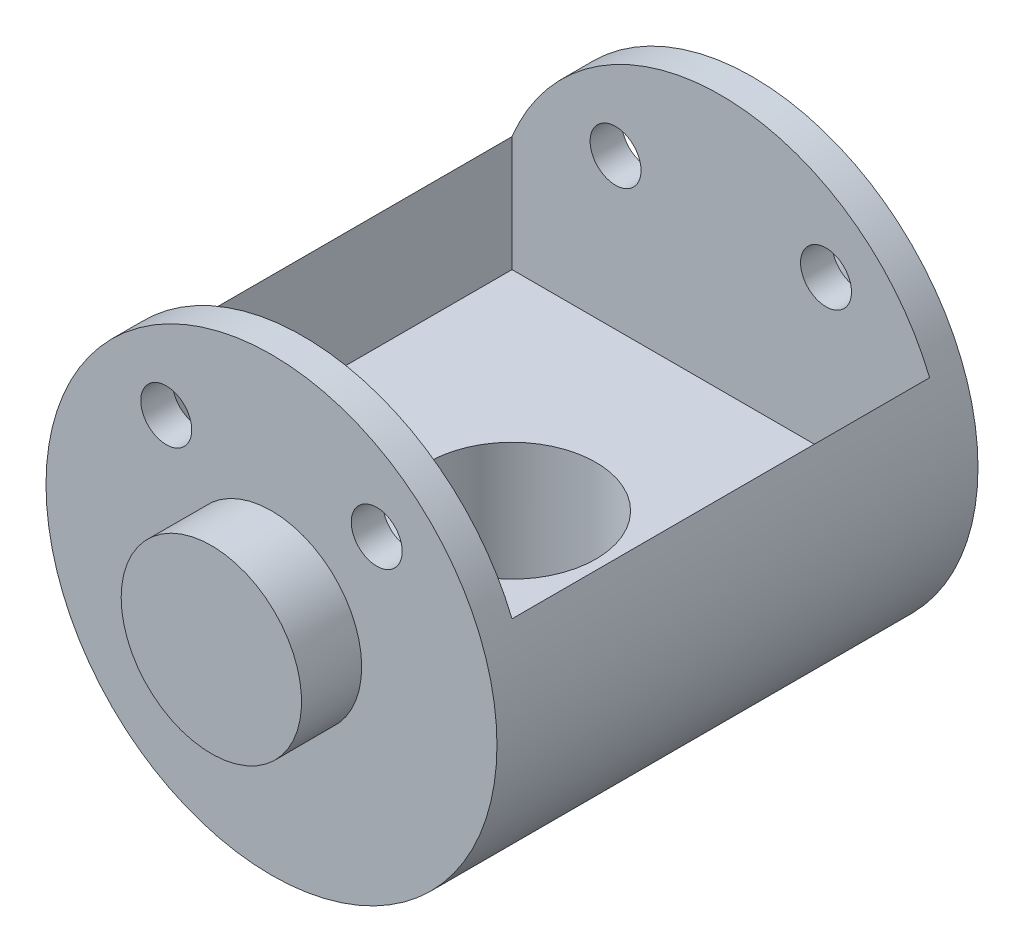
ISO-10303-21;
HEADER;
FILE_DESCRIPTION(('STEP AP214'),'2;1');
FILE_NAME('part.step','',(''),(''),'','','');
FILE_SCHEMA(('AUTOMOTIVE_DESIGN { 1 0 10303 214 1 1 1 1 }'));
ENDSEC;
DATA;
#1=APPLICATION_CONTEXT('core data for automotive mechanical design processes');
#2=APPLICATION_PROTOCOL_DEFINITION('international standard','automotive_design',2000,#1);
#3=PRODUCT_CONTEXT('',#1,'mechanical');
#4=PRODUCT('Part','Part','',(#3));
#5=PRODUCT_RELATED_PRODUCT_CATEGORY('part','',(#4));
#6=PRODUCT_DEFINITION_FORMATION('','',#4);
#7=PRODUCT_DEFINITION_CONTEXT('part definition',#1,'design');
#8=PRODUCT_DEFINITION('design','',#6,#7);
#9=PRODUCT_DEFINITION_SHAPE('','',#8);
#10=(LENGTH_UNIT() NAMED_UNIT(*) SI_UNIT(.MILLI.,.METRE.));
#11=(NAMED_UNIT(*) PLANE_ANGLE_UNIT() SI_UNIT($,.RADIAN.));
#12=(NAMED_UNIT(*) SI_UNIT($,.STERADIAN.) SOLID_ANGLE_UNIT());
#13=UNCERTAINTY_MEASURE_WITH_UNIT(LENGTH_MEASURE(1.E-05),#10,'distance_accuracy_value','');
#14=(GEOMETRIC_REPRESENTATION_CONTEXT(3) GLOBAL_UNCERTAINTY_ASSIGNED_CONTEXT((#13)) GLOBAL_UNIT_ASSIGNED_CONTEXT((#10,
#11,#12)) REPRESENTATION_CONTEXT('',''));
#15=CARTESIAN_POINT('',(0.,0.,0.));
#16=DIRECTION('',(0.,0.,1.));
#17=DIRECTION('',(1.,0.,0.));
#18=AXIS2_PLACEMENT_3D('',#15,#16,#17);
#19=CARTESIAN_POINT('',(0.,0.,-20.32));
#20=DIRECTION('',(0.,0.,1.));
#21=DIRECTION('',(1.,0.,0.));
#22=AXIS2_PLACEMENT_3D('',#19,#20,#21);
#23=PLANE('',#22);
#24=CARTESIAN_POINT('',(8.89,10.16,-20.32));
#25=DIRECTION('',(0.,0.,-1.));
#26=DIRECTION('',(-1.,0.,0.));
#27=AXIS2_PLACEMENT_3D('',#24,#25,#26);
#28=CIRCLE('',#27,2.15264999999999);
#29=CARTESIAN_POINT('',(6.73735000000001,10.16,-20.32));
#30=VERTEX_POINT('',#29);
#31=EDGE_CURVE('E251',#30,#30,#28,.T.);
#32=ORIENTED_EDGE('',*,*,#31,.F.);
#33=EDGE_LOOP('',(#32));
#34=FACE_BOUND('',#33,.T.);
#35=CARTESIAN_POINT('',(-8.89,10.16,-20.32));
#36=DIRECTION('',(0.,0.,-1.));
#37=DIRECTION('',(-1.,0.,0.));
#38=AXIS2_PLACEMENT_3D('',#35,#36,#37);
#39=CIRCLE('',#38,2.15264999999999);
#40=CARTESIAN_POINT('',(-11.04265,10.16,-20.32));
#41=VERTEX_POINT('',#40);
#42=EDGE_CURVE('E138',#41,#41,#39,.T.);
#43=ORIENTED_EDGE('',*,*,#42,.F.);
#44=EDGE_LOOP('',(#43));
#45=FACE_BOUND('',#44,.T.);
#46=CARTESIAN_POINT('',(0.,0.,-20.32));
#47=DIRECTION('',(0.,0.,1.));
#48=DIRECTION('',(1.,0.,0.));
#49=AXIS2_PLACEMENT_3D('',#46,#47,#48);
#50=CIRCLE('',#49,19.05);
#51=CARTESIAN_POINT('',(19.05,0.,-20.32));
#52=VERTEX_POINT('',#51);
#53=EDGE_CURVE('E118',#52,#52,#50,.T.);
#54=ORIENTED_EDGE('',*,*,#53,.F.);
#55=EDGE_LOOP('',(#54));
#56=FACE_BOUND('',#55,.T.);
#57=CARTESIAN_POINT('',(0.,0.,-20.32));
#58=DIRECTION('',(0.,0.,1.));
#59=DIRECTION('',(1.,0.,0.));
#60=AXIS2_PLACEMENT_3D('',#57,#58,#59);
#61=CIRCLE('',#60,7.62);
#62=CARTESIAN_POINT('',(7.62,0.,-20.32));
#63=VERTEX_POINT('',#62);
#64=EDGE_CURVE('E49',#63,#63,#61,.F.);
#65=ORIENTED_EDGE('',*,*,#64,.F.);
#66=EDGE_LOOP('',(#65));
#67=FACE_BOUND('',#66,.T.);
#68=ADVANCED_FACE('F39',(#34,#45,#56,#67),#23,.F.);
#69=CARTESIAN_POINT('',(0.,0.,20.32));
#70=DIRECTION('',(0.,0.,-1.));
#71=DIRECTION('',(-1.,0.,0.));
#72=AXIS2_PLACEMENT_3D('',#69,#70,#71);
#73=CYLINDRICAL_SURFACE('',#72,19.05);
#74=CARTESIAN_POINT('',(0.,-19.05,7.0866));
#75=CARTESIAN_POINT('',(0.191987180953213,-19.0500006025065,7.08660082549721));
#76=CARTESIAN_POINT('',(0.383962878872073,-19.0470914415268,7.07879219459247));
#77=CARTESIAN_POINT('',(0.766476462972162,-19.0355356910786,7.04764003583637));
#78=CARTESIAN_POINT('',(0.957014372438257,-19.0268891947284,7.02429676011577));
#79=CARTESIAN_POINT('',(1.33521378134161,-19.004094096491,6.9623142780149));
#80=CARTESIAN_POINT('',(1.52287574632214,-18.9899463951017,6.92367757501263));
#81=CARTESIAN_POINT('',(1.89403027990376,-18.956525815213,6.83147969228255));
#82=CARTESIAN_POINT('',(2.07752274401497,-18.9372528084243,6.77791813897529));
#83=CARTESIAN_POINT('',(2.43870669585005,-18.8941319372979,6.65648806465393));
#84=CARTESIAN_POINT('',(2.61640978102867,-18.8702939734176,6.58865047450458));
#85=CARTESIAN_POINT('',(2.96536264456177,-18.818614429401,6.43914346133306));
#86=CARTESIAN_POINT('',(3.13661015283826,-18.7907714571917,6.35746922716608));
#87=CARTESIAN_POINT('',(3.4715437379877,-18.7317857874318,6.18094775415764));
#88=CARTESIAN_POINT('',(3.63523087042749,-18.7006435525308,6.08610236170476));
#89=CARTESIAN_POINT('',(3.95420467014373,-18.6358060401004,5.88386281877986));
#90=CARTESIAN_POINT('',(4.10948827643264,-18.6021098428758,5.77646414018285));
#91=CARTESIAN_POINT('',(4.41642179067274,-18.5316873149622,5.54557215743041));
#92=CARTESIAN_POINT('',(4.56771563170984,-18.4948946926351,5.4216255804887));
#93=CARTESIAN_POINT('',(4.8594290192711,-18.420399478368,5.16178322620706));
#94=CARTESIAN_POINT('',(4.99984825406556,-18.3826968603828,5.02588710656175));
#95=CARTESIAN_POINT('',(5.26906303602258,-18.3073489413475,4.74289271305236));
#96=CARTESIAN_POINT('',(5.39785325942651,-18.2697036742279,4.5957893647701));
#97=CARTESIAN_POINT('',(5.6429201869399,-18.1955033278778,4.29133165104832));
#98=CARTESIAN_POINT('',(5.75920110919677,-18.1589478841823,4.13398076999982));
#99=CARTESIAN_POINT('',(5.9827033548706,-18.0865718242029,3.80373504435));
#100=CARTESIAN_POINT('',(6.08941534505641,-18.0508313600656,3.63047731754099));
#101=CARTESIAN_POINT('',(6.28775003131927,-17.9827054805815,3.27498251455956));
#102=CARTESIAN_POINT('',(6.37937837661231,-17.9503188108453,3.09274883348943));
#103=CARTESIAN_POINT('',(6.54680353124825,-17.8899353914296,2.72046194248607));
#104=CARTESIAN_POINT('',(6.62260197815283,-17.8619381877462,2.53040954381588));
#105=CARTESIAN_POINT('',(6.75765050819724,-17.8112848710576,2.14382211949735));
#106=CARTESIAN_POINT('',(6.81690154456776,-17.7886284504028,1.94728746799544));
#107=CARTESIAN_POINT('',(6.91618187551041,-17.750257639055,1.55729338138233));
#108=CARTESIAN_POINT('',(6.95689180548758,-17.7342994915601,1.3640311799405));
#109=CARTESIAN_POINT('',(7.02207153616154,-17.7085923757045,0.974383268682623));
#110=CARTESIAN_POINT('',(7.04654230915578,-17.6988430356015,0.777997746592225));
#111=CARTESIAN_POINT('',(7.07896712474831,-17.6858992021444,0.383717139490306));
#112=CARTESIAN_POINT('',(7.08692663718099,-17.6827025380304,0.185822576204614));
#113=CARTESIAN_POINT('',(7.08625286067189,-17.6829726701273,-0.209929876533574));
#114=CARTESIAN_POINT('',(7.07762020106336,-17.686439213606,-0.407787767092374));
#115=CARTESIAN_POINT('',(7.04486192420565,-17.6995114010242,-0.790223994660567));
#116=CARTESIAN_POINT('',(7.02168058800945,-17.7087427129936,-0.974896992815151));
#117=CARTESIAN_POINT('',(6.96093791862004,-17.7327073096179,-1.341561066605));
#118=CARTESIAN_POINT('',(6.92337189240526,-17.7474423898451,-1.52355124682333));
#119=CARTESIAN_POINT('',(6.83422482220317,-17.7819613856286,-1.8835194714139));
#120=CARTESIAN_POINT('',(6.78264738571455,-17.8017440015234,-2.0614985357665));
#121=CARTESIAN_POINT('',(6.66590144261445,-17.8457879525196,-2.41244074173724));
#122=CARTESIAN_POINT('',(6.6007277392484,-17.8700509997197,-2.5854019365522));
#123=CARTESIAN_POINT('',(6.45600502342375,-17.92284957273,-2.92833901399367));
#124=CARTESIAN_POINT('',(6.37621437511422,-17.9514552705765,-3.09820203629046));
#125=CARTESIAN_POINT('',(6.20365832652766,-18.011814920161,-3.43068768986758));
#126=CARTESIAN_POINT('',(6.11088851475531,-18.0435699412516,-3.59330783448204));
#127=CARTESIAN_POINT('',(5.91300946098032,-18.1093812173131,-3.91038963474738));
#128=CARTESIAN_POINT('',(5.8078988728335,-18.14343772316,-4.06485039769533));
#129=CARTESIAN_POINT('',(5.5859889788566,-18.2129828875813,-4.36479478246566));
#130=CARTESIAN_POINT('',(5.4691891535217,-18.2484716097659,-4.51027800483423));
#131=CARTESIAN_POINT('',(5.2164480212898,-18.3223805654747,-4.80083947201313));
#132=CARTESIAN_POINT('',(5.07975108759153,-18.3608391790293,-4.94525157027877));
#133=CARTESIAN_POINT('',(4.7946960699386,-18.4373305219001,-5.22209280156961));
#134=CARTESIAN_POINT('',(4.64634154668223,-18.4753633772363,-5.3545255671854));
#135=CARTESIAN_POINT('',(4.33872674045665,-18.5500137022386,-5.60668541174296));
#136=CARTESIAN_POINT('',(4.17946074079715,-18.5866304140041,-5.72640574539145));
#137=CARTESIAN_POINT('',(3.85110681706626,-18.6574293097552,-5.95218933045527));
#138=CARTESIAN_POINT('',(3.68202284518044,-18.6916124611936,-6.05825802273114));
#139=CARTESIAN_POINT('',(3.33232257669748,-18.7571387270159,-6.25752721429371));
#140=CARTESIAN_POINT('',(3.1515682158857,-18.7884296482278,-6.35050293891121));
#141=CARTESIAN_POINT('',(2.78222513360395,-18.846661642966,-6.52077107472296));
#142=CARTESIAN_POINT('',(2.59363955122951,-18.8736044386485,-6.5980696982546));
#143=CARTESIAN_POINT('',(2.20994200375227,-18.9223689488221,-6.73629202222034));
#144=CARTESIAN_POINT('',(2.01483099958272,-18.9441914135721,-6.79721812183651));
#145=CARTESIAN_POINT('',(1.61955056384276,-18.9820695496823,-6.90208364475799));
#146=CARTESIAN_POINT('',(1.41938143035421,-18.9981255600225,-6.94602406657484));
#147=CARTESIAN_POINT('',(1.02619595854081,-19.0233060683096,-7.01459428028727));
#148=CARTESIAN_POINT('',(0.833355276261449,-19.0327500124499,-7.04011619839301));
#149=CARTESIAN_POINT('',(0.446034067052014,-19.0457631269685,-7.07522159949804));
#150=CARTESIAN_POINT('',(0.251553607693218,-19.0493325382445,-7.08480573606007));
#151=CARTESIAN_POINT('',(-0.137516443921217,-19.0504967989839,-7.08793548665584));
#152=CARTESIAN_POINT('',(-0.332106008740088,-19.0480927730481,-7.08148411964492));
#153=CARTESIAN_POINT('',(-0.719930942716069,-19.0373797624586,-7.05261707189951));
#154=CARTESIAN_POINT('',(-0.913166331866496,-19.0290708651719,-7.03020162736536));
#155=CARTESIAN_POINT('',(-1.28953517534237,-19.0072033803743,-6.97078970249129));
#156=CARTESIAN_POINT('',(-1.47277376871735,-18.9938558965282,-6.93437860998223));
#157=CARTESIAN_POINT('',(-1.83546504802587,-18.9622444818789,-6.84731773608349));
#158=CARTESIAN_POINT('',(-2.01491646474905,-18.9439789302197,-6.79666326023292));
#159=CARTESIAN_POINT('',(-2.36876197779718,-18.902994044219,-6.68157703869978));
#160=CARTESIAN_POINT('',(-2.54315743446256,-18.8802759208811,-6.61714903868736));
#161=CARTESIAN_POINT('',(-2.88594392999324,-18.8309274327995,-6.47500344366767));
#162=CARTESIAN_POINT('',(-3.05433266064059,-18.8042955838235,-6.39728080499107));
#163=CARTESIAN_POINT('',(-3.3888272255994,-18.7469455939913,-6.22671687351012));
#164=CARTESIAN_POINT('',(-3.55472731052718,-18.7161317864338,-6.13350433360505));
#165=CARTESIAN_POINT('',(-3.87817801365688,-18.6517945468462,-5.93428405896761));
#166=CARTESIAN_POINT('',(-4.0357257357203,-18.618270184989,-5.82827192726563));
#167=CARTESIAN_POINT('',(-4.34156998211458,-18.54933555523,-5.60416065279692));
#168=CARTESIAN_POINT('',(-4.48986517601355,-18.5139250174637,-5.48605977819305));
#169=CARTESIAN_POINT('',(-4.77638751066757,-18.4420834405439,-5.23849892539965));
#170=CARTESIAN_POINT('',(-4.91461429136885,-18.4056523649596,-5.10903854135045));
#171=CARTESIAN_POINT('',(-5.18787182726675,-18.3305673192637,-4.8317607129809));
#172=CARTESIAN_POINT('',(-5.32226518128261,-18.2919056352189,-4.6833163855833));
#173=CARTESIAN_POINT('',(-5.57807742042906,-18.2155255420832,-4.37549862569694));
#174=CARTESIAN_POINT('',(-5.69950046192882,-18.1778068337991,-4.21612872137675));
#175=CARTESIAN_POINT('',(-5.92867008748369,-18.1043602691574,-3.88728092652312));
#176=CARTESIAN_POINT('',(-6.03640989843957,-18.0686334036181,-3.71779809069813));
#177=CARTESIAN_POINT('',(-6.2373088393245,-18.0002704936013,-3.36989734540076));
#178=CARTESIAN_POINT('',(-6.33047409849199,-17.9676331521361,-3.19148323381576));
#179=CARTESIAN_POINT('',(-6.50186701996166,-17.9063270642825,-2.82604286164464));
#180=CARTESIAN_POINT('',(-6.58003218079234,-17.8776750544618,-2.6389844310681));
#181=CARTESIAN_POINT('',(-6.72020114231063,-17.8254591714672,-2.25829969395717));
#182=CARTESIAN_POINT('',(-6.78221169945592,-17.8018931718439,-2.06467617160576));
#183=CARTESIAN_POINT('',(-6.88946562217469,-17.760660718591,-1.67227946873576));
#184=CARTESIAN_POINT('',(-6.93471390376833,-17.7429925354074,-1.47350781638115));
#185=CARTESIAN_POINT('',(-7.00796222230641,-17.7141898462923,-1.0723477734827));
#186=CARTESIAN_POINT('',(-7.0359634354151,-17.7030548948292,-0.869959630534335));
#187=CARTESIAN_POINT('',(-7.07317370748275,-17.6882187695617,-0.476151021258169));
#188=CARTESIAN_POINT('',(-7.08346061025267,-17.6840914573073,-0.284847727142922));
#189=CARTESIAN_POINT('',(-7.08850764112946,-17.6820691471869,0.0979945171939694));
#190=CARTESIAN_POINT('',(-7.08326827197176,-17.6841739475272,0.289533459584667));
#191=CARTESIAN_POINT('',(-7.05732087130365,-17.6945447783049,0.671370760921153));
#192=CARTESIAN_POINT('',(-7.03661430499424,-17.7028102251467,0.861669235653606));
#193=CARTESIAN_POINT('',(-6.97995271275813,-17.7252273869034,1.23962733476809));
#194=CARTESIAN_POINT('',(-6.94399769168334,-17.7393790999452,1.42728695998976));
#195=CARTESIAN_POINT('',(-6.85849578837578,-17.7726072719201,1.7930863243705));
#196=CARTESIAN_POINT('',(-6.80938604392577,-17.7915243435163,1.9713430887871));
#197=CARTESIAN_POINT('',(-6.69757028755295,-17.8339178384784,2.32304032521888));
#198=CARTESIAN_POINT('',(-6.63485979429018,-17.8573957643433,2.4964791884746));
#199=CARTESIAN_POINT('',(-6.49636120531464,-17.908244662237,2.83743431895221));
#200=CARTESIAN_POINT('',(-6.42057525183649,-17.9356149964191,3.00495155094362));
#201=CARTESIAN_POINT('',(-6.25647212969857,-17.9935162160954,3.33319233807414));
#202=CARTESIAN_POINT('',(-6.16815010143702,-18.024048326003,3.49391322710756));
#203=CARTESIAN_POINT('',(-5.87553644205485,-18.1224821945438,3.98069330893781));
#204=CARTESIAN_POINT('',(-5.65067252409543,-18.1944993138518,4.29385302411652));
#205=CARTESIAN_POINT('',(-5.15360359923203,-18.3414777128663,4.87932612670176));
#206=CARTESIAN_POINT('',(-4.88138366908356,-18.416439914871,5.15162658764663));
#207=CARTESIAN_POINT('',(-4.43465486108879,-18.527322347388,5.53125118987912));
#208=CARTESIAN_POINT('',(-4.27482729916007,-18.5649391790074,5.655690430805));
#209=CARTESIAN_POINT('',(-3.94477744640695,-18.6378577301386,5.89063782099102));
#210=CARTESIAN_POINT('',(-3.77455906606,-18.6731603103479,6.00115116372195));
#211=CARTESIAN_POINT('',(-3.4246957103888,-18.740483333088,6.20746583105824));
#212=CARTESIAN_POINT('',(-3.24504599709349,-18.7725021016251,6.30325966435138));
#213=CARTESIAN_POINT('',(-2.87766560191185,-18.8323167742714,6.4792283926568));
#214=CARTESIAN_POINT('',(-2.68993840147292,-18.8601144747472,6.55940993593949));
#215=CARTESIAN_POINT('',(-2.30059459261309,-18.9116293330441,6.70611814329437));
#216=CARTESIAN_POINT('',(-2.09872107530474,-18.9351578638237,6.77203111077257));
#217=CARTESIAN_POINT('',(-1.68927615543856,-18.9760684020153,6.88559222638832));
#218=CARTESIAN_POINT('',(-1.48170450545105,-18.993450142059,6.93323958003053));
#219=CARTESIAN_POINT('',(-1.06275468199792,-19.0214907040104,7.00969144964932));
#220=CARTESIAN_POINT('',(-0.851378079451622,-19.0321522377976,7.03850356659306));
#221=CARTESIAN_POINT('',(-0.426662788431813,-19.0464061847988,7.07695638985352));
#222=CARTESIAN_POINT('',(-0.213324305576476,-19.049999330532,7.08659908275845));
#223=CARTESIAN_POINT('',(0.,-19.05,7.0866));
#224=B_SPLINE_CURVE_WITH_KNOTS('',3,(#74,#75,#76,#77,#78,#79,#80,#81,#82,#83,#84,#85,#86,#87,
#88,#89,#90,#91,#92,#93,#94,#95,#96,#97,#98,#99,#100,#101,#102,#103,#104,#105,#106,#107,#108,
#109,#110,#111,#112,#113,#114,#115,#116,#117,#118,#119,#120,#121,#122,#123,#124,#125,#126,#127,
#128,#129,#130,#131,#132,#133,#134,#135,#136,#137,#138,#139,#140,#141,#142,#143,#144,#145,#146,
#147,#148,#149,#150,#151,#152,#153,#154,#155,#156,#157,#158,#159,#160,#161,#162,#163,#164,#165,
#166,#167,#168,#169,#170,#171,#172,#173,#174,#175,#176,#177,#178,#179,#180,#181,#182,#183,#184,
#185,#186,#187,#188,#189,#190,#191,#192,#193,#194,#195,#196,#197,#198,#199,#200,#201,#202,#203,
#204,#205,#206,#207,#208,#209,#210,#211,#212,#213,#214,#215,#216,#217,#218,#219,#220,#221,#222,
#223),.UNSPECIFIED.,.T.,.F.,(4,2,2,2,2,2,2,2,2,2,2,2,2,2,2,2,2,2,2,2,2,2,2,2,2,2,2,2,2,2,2,2,2,
2,2,2,2,2,2,2,2,2,2,2,2,2,2,2,2,2,2,2,2,2,2,2,2,2,2,2,2,2,2,2,2,2,2,2,2,2,2,2,2,2,4),(0.,
0.575761862470707,1.15151438042604,1.72717269251742,2.30284541503403,2.87728347871859,
3.45192169198235,4.02647943120115,4.60124506380347,5.19761835923006,5.79400874387349,
6.39067078609744,6.987130998513,7.60616191187696,8.22496045203233,8.84369494735111,
9.46239379247438,10.0560635830753,10.6496978252966,11.2431353775151,11.8365504213714,
12.3949487210416,12.9535293542279,13.5119663065031,14.0706170964726,14.6395095436838,
15.2085958239623,15.7777442385141,16.3469179589739,16.9538220415688,17.5605414663837,
18.1675812282196,18.7743783002515,19.3905745172106,20.0065260760152,20.6223873257882,
21.2382123663431,21.8217305184435,22.4052247415466,22.9886091202927,23.5719848676144,
24.1332302927503,24.6946609154021,25.2559390523963,25.8174305991441,26.3951087300847,
26.9729858751105,27.5509459231747,28.1289266293725,28.7400386927007,29.3509543324056,
29.9621712019629,30.5731303329785,31.1865823800264,31.7997774451472,32.4127925305104,
33.025765806665,33.5999178430563,34.1740512888018,34.7481303540264,35.3222092365841,
35.8791743361568,36.4363232309173,36.9933809310124,37.5506551669728,38.721815994665,
39.8933465596692,40.5107787170975,41.1279799259607,41.7454942187001,42.362744973938,
43.0027929535975,43.6428687701229,44.2826861240871,44.9224371682931),.UNSPECIFIED.);
#225=CARTESIAN_POINT('',(0.,-19.05,7.0866));
#226=VERTEX_POINT('',#225);
#227=EDGE_CURVE('E104',#226,#226,#224,.T.);
#228=ORIENTED_EDGE('',*,*,#227,.T.);
#229=EDGE_LOOP('',(#228));
#230=FACE_BOUND('',#229,.T.);
#231=DIRECTION('',(0.,0.,-1.));
#232=VECTOR('',#231,1.);
#233=CARTESIAN_POINT('',(-17.6403,7.19182285029324,20.32));
#234=LINE('',#233,#232);
#235=CARTESIAN_POINT('',(-17.6403,7.19182285029324,17.6403));
#236=VERTEX_POINT('',#235);
#237=CARTESIAN_POINT('',(-17.6403,7.19182285029324,-17.6403));
#238=VERTEX_POINT('',#237);
#239=EDGE_CURVE('E131',#236,#238,#234,.T.);
#240=ORIENTED_EDGE('',*,*,#239,.T.);
#241=CARTESIAN_POINT('',(0.,0.,-17.6403));
#242=DIRECTION('',(0.,0.,-1.));
#243=DIRECTION('',(-1.,0.,0.));
#244=AXIS2_PLACEMENT_3D('',#241,#242,#243);
#245=CIRCLE('',#244,19.05);
#246=CARTESIAN_POINT('',(17.6403,7.19182285029324,-17.6403));
#247=VERTEX_POINT('',#246);
#248=EDGE_CURVE('E125',#238,#247,#245,.T.);
#249=ORIENTED_EDGE('',*,*,#248,.T.);
#250=DIRECTION('',(0.,0.,-1.));
#251=VECTOR('',#250,1.);
#252=CARTESIAN_POINT('',(17.6403,7.19182285029324,20.32));
#253=LINE('',#252,#251);
#254=CARTESIAN_POINT('',(17.6403,7.19182285029324,17.6403));
#255=VERTEX_POINT('',#254);
#256=EDGE_CURVE('E88',#247,#255,#253,.F.);
#257=ORIENTED_EDGE('',*,*,#256,.T.);
#258=CARTESIAN_POINT('',(0.,0.,17.6403));
#259=DIRECTION('',(0.,0.,1.));
#260=DIRECTION('',(1.,0.,0.));
#261=AXIS2_PLACEMENT_3D('',#258,#259,#260);
#262=CIRCLE('',#261,19.05);
#263=EDGE_CURVE('E65',#255,#236,#262,.T.);
#264=ORIENTED_EDGE('',*,*,#263,.T.);
#265=EDGE_LOOP('',(#240,#249,#257,#264));
#266=FACE_BOUND('',#265,.T.);
#267=CARTESIAN_POINT('',(0.,0.,20.32));
#268=DIRECTION('',(0.,0.,1.));
#269=DIRECTION('',(1.,0.,0.));
#270=AXIS2_PLACEMENT_3D('',#267,#268,#269);
#271=CIRCLE('',#270,19.05);
#272=CARTESIAN_POINT('',(19.05,0.,20.32));
#273=VERTEX_POINT('',#272);
#274=EDGE_CURVE('E122',#273,#273,#271,.T.);
#275=ORIENTED_EDGE('',*,*,#274,.F.);
#276=EDGE_LOOP('',(#275));
#277=FACE_BOUND('',#276,.T.);
#278=ORIENTED_EDGE('',*,*,#53,.T.);
#279=EDGE_LOOP('',(#278));
#280=FACE_BOUND('',#279,.T.);
#281=ADVANCED_FACE('F41',(#230,#266,#277,#280),#73,.T.);
#282=CARTESIAN_POINT('',(0.,0.,20.32));
#283=DIRECTION('',(0.,0.,1.));
#284=DIRECTION('',(1.,0.,0.));
#285=AXIS2_PLACEMENT_3D('',#282,#283,#284);
#286=PLANE('',#285);
#287=CARTESIAN_POINT('',(8.89,10.16,20.32));
#288=DIRECTION('',(0.,0.,1.));
#289=DIRECTION('',(1.,0.,0.));
#290=AXIS2_PLACEMENT_3D('',#287,#288,#289);
#291=CIRCLE('',#290,2.15264999999999);
#292=CARTESIAN_POINT('',(11.04265,10.16,20.32));
#293=VERTEX_POINT('',#292);
#294=EDGE_CURVE('E145',#293,#293,#291,.T.);
#295=ORIENTED_EDGE('',*,*,#294,.F.);
#296=EDGE_LOOP('',(#295));
#297=FACE_BOUND('',#296,.T.);
#298=CARTESIAN_POINT('',(-8.89,10.16,20.32));
#299=DIRECTION('',(0.,0.,1.));
#300=DIRECTION('',(1.,0.,0.));
#301=AXIS2_PLACEMENT_3D('',#298,#299,#300);
#302=CIRCLE('',#301,2.15264999999999);
#303=CARTESIAN_POINT('',(-6.73735000000001,10.16,20.32));
#304=VERTEX_POINT('',#303);
#305=EDGE_CURVE('E142',#304,#304,#302,.T.);
#306=ORIENTED_EDGE('',*,*,#305,.F.);
#307=EDGE_LOOP('',(#306));
#308=FACE_BOUND('',#307,.T.);
#309=CARTESIAN_POINT('',(0.,0.,20.32));
#310=DIRECTION('',(0.,0.,1.));
#311=DIRECTION('',(1.,0.,0.));
#312=AXIS2_PLACEMENT_3D('',#309,#310,#311);
#313=CIRCLE('',#312,7.62);
#314=CARTESIAN_POINT('',(7.62,0.,20.32));
#315=VERTEX_POINT('',#314);
#316=EDGE_CURVE('E11',#315,#315,#313,.T.);
#317=ORIENTED_EDGE('',*,*,#316,.F.);
#318=EDGE_LOOP('',(#317));
#319=FACE_BOUND('',#318,.T.);
#320=ORIENTED_EDGE('',*,*,#274,.T.);
#321=EDGE_LOOP('',(#320));
#322=FACE_BOUND('',#321,.T.);
#323=ADVANCED_FACE('F186',(#297,#308,#319,#322),#286,.T.);
#324=CARTESIAN_POINT('',(17.6403,-2.54,-17.6403));
#325=DIRECTION('',(1.,0.,0.));
#326=DIRECTION('',(0.,0.,-1.));
#327=AXIS2_PLACEMENT_3D('',#324,#325,#326);
#328=PLANE('',#327);
#329=DIRECTION('',(0.,1.,0.));
#330=VECTOR('',#329,1.);
#331=CARTESIAN_POINT('',(17.6403,-2.54,-17.6403));
#332=LINE('',#331,#330);
#333=CARTESIAN_POINT('',(17.6403,-2.54,-17.6403));
#334=VERTEX_POINT('',#333);
#335=EDGE_CURVE('E57',#334,#247,#332,.T.);
#336=ORIENTED_EDGE('',*,*,#335,.F.);
#337=DIRECTION('',(0.,0.,-1.));
#338=VECTOR('',#337,1.);
#339=CARTESIAN_POINT('',(17.6403,-2.54,-17.6403));
#340=LINE('',#339,#338);
#341=CARTESIAN_POINT('',(17.6403,-2.54,17.6403));
#342=VERTEX_POINT('',#341);
#343=EDGE_CURVE('E85',#342,#334,#340,.T.);
#344=ORIENTED_EDGE('',*,*,#343,.F.);
#345=DIRECTION('',(0.,1.,0.));
#346=VECTOR('',#345,1.);
#347=CARTESIAN_POINT('',(17.6403,-2.54,17.6403));
#348=LINE('',#347,#346);
#349=EDGE_CURVE('E116',#342,#255,#348,.T.);
#350=ORIENTED_EDGE('',*,*,#349,.T.);
#351=ORIENTED_EDGE('',*,*,#256,.F.);
#352=EDGE_LOOP('',(#336,#344,#350,#351));
#353=FACE_BOUND('',#352,.T.);
#354=ADVANCED_FACE('F83',(#353),#328,.F.);
#355=CARTESIAN_POINT('',(-17.6403,-2.54,17.6403));
#356=DIRECTION('',(0.,0.,1.));
#357=DIRECTION('',(1.,0.,0.));
#358=AXIS2_PLACEMENT_3D('',#355,#356,#357);
#359=PLANE('',#358);
#360=CARTESIAN_POINT('',(8.89,10.16,17.6403));
#361=DIRECTION('',(0.,0.,1.));
#362=DIRECTION('',(1.,0.,0.));
#363=AXIS2_PLACEMENT_3D('',#360,#361,#362);
#364=CIRCLE('',#363,2.15264999999999);
#365=CARTESIAN_POINT('',(11.04265,10.16,17.6403));
#366=VERTEX_POINT('',#365);
#367=EDGE_CURVE('E150',#366,#366,#364,.T.);
#368=ORIENTED_EDGE('',*,*,#367,.T.);
#369=EDGE_LOOP('',(#368));
#370=FACE_BOUND('',#369,.T.);
#371=CARTESIAN_POINT('',(-8.89,10.16,17.6403));
#372=DIRECTION('',(0.,0.,1.));
#373=DIRECTION('',(1.,0.,0.));
#374=AXIS2_PLACEMENT_3D('',#371,#372,#373);
#375=CIRCLE('',#374,2.15264999999999);
#376=CARTESIAN_POINT('',(-6.73735000000001,10.16,17.6403));
#377=VERTEX_POINT('',#376);
#378=EDGE_CURVE('E137',#377,#377,#375,.T.);
#379=ORIENTED_EDGE('',*,*,#378,.T.);
#380=EDGE_LOOP('',(#379));
#381=FACE_BOUND('',#380,.T.);
#382=ORIENTED_EDGE('',*,*,#349,.F.);
#383=DIRECTION('',(1.,0.,0.));
#384=VECTOR('',#383,1.);
#385=CARTESIAN_POINT('',(-17.6403,-2.54,17.6403));
#386=LINE('',#385,#384);
#387=CARTESIAN_POINT('',(-17.6403,-2.54,17.6403));
#388=VERTEX_POINT('',#387);
#389=EDGE_CURVE('E91',#388,#342,#386,.T.);
#390=ORIENTED_EDGE('',*,*,#389,.F.);
#391=DIRECTION('',(0.,1.,0.));
#392=VECTOR('',#391,1.);
#393=CARTESIAN_POINT('',(-17.6403,-2.54,17.6403));
#394=LINE('',#393,#392);
#395=EDGE_CURVE('E119',#388,#236,#394,.T.);
#396=ORIENTED_EDGE('',*,*,#395,.T.);
#397=ORIENTED_EDGE('',*,*,#263,.F.);
#398=EDGE_LOOP('',(#382,#390,#396,#397));
#399=FACE_BOUND('',#398,.T.);
#400=ADVANCED_FACE('F194',(#370,#381,#399),#359,.F.);
#401=CARTESIAN_POINT('',(-17.6403,-2.54,-17.6403));
#402=DIRECTION('',(-1.,0.,0.));
#403=DIRECTION('',(0.,0.,1.));
#404=AXIS2_PLACEMENT_3D('',#401,#402,#403);
#405=PLANE('',#404);
#406=ORIENTED_EDGE('',*,*,#395,.F.);
#407=DIRECTION('',(0.,0.,1.));
#408=VECTOR('',#407,1.);
#409=CARTESIAN_POINT('',(-17.6403,-2.54,-17.6403));
#410=LINE('',#409,#408);
#411=CARTESIAN_POINT('',(-17.6403,-2.54,-17.6403));
#412=VERTEX_POINT('',#411);
#413=EDGE_CURVE('E100',#412,#388,#410,.T.);
#414=ORIENTED_EDGE('',*,*,#413,.F.);
#415=DIRECTION('',(0.,1.,0.));
#416=VECTOR('',#415,1.);
#417=CARTESIAN_POINT('',(-17.6403,-2.54,-17.6403));
#418=LINE('',#417,#416);
#419=EDGE_CURVE('E90',#412,#238,#418,.T.);
#420=ORIENTED_EDGE('',*,*,#419,.T.);
#421=ORIENTED_EDGE('',*,*,#239,.F.);
#422=EDGE_LOOP('',(#406,#414,#420,#421));
#423=FACE_BOUND('',#422,.T.);
#424=ADVANCED_FACE('F175',(#423),#405,.F.);
#425=CARTESIAN_POINT('',(-17.6403,-2.54,-17.6403));
#426=DIRECTION('',(0.,0.,-1.));
#427=DIRECTION('',(-1.,0.,0.));
#428=AXIS2_PLACEMENT_3D('',#425,#426,#427);
#429=PLANE('',#428);
#430=CARTESIAN_POINT('',(8.89,10.16,-17.6403));
#431=DIRECTION('',(0.,0.,-1.));
#432=DIRECTION('',(-1.,0.,0.));
#433=AXIS2_PLACEMENT_3D('',#430,#431,#432);
#434=CIRCLE('',#433,2.15264999999999);
#435=CARTESIAN_POINT('',(6.73735000000001,10.16,-17.6403));
#436=VERTEX_POINT('',#435);
#437=EDGE_CURVE('E44',#436,#436,#434,.T.);
#438=ORIENTED_EDGE('',*,*,#437,.T.);
#439=EDGE_LOOP('',(#438));
#440=FACE_BOUND('',#439,.T.);
#441=CARTESIAN_POINT('',(-8.89,10.16,-17.6403));
#442=DIRECTION('',(0.,0.,-1.));
#443=DIRECTION('',(-1.,0.,0.));
#444=AXIS2_PLACEMENT_3D('',#441,#442,#443);
#445=CIRCLE('',#444,2.15264999999999);
#446=CARTESIAN_POINT('',(-11.04265,10.16,-17.6403));
#447=VERTEX_POINT('',#446);
#448=EDGE_CURVE('E135',#447,#447,#445,.T.);
#449=ORIENTED_EDGE('',*,*,#448,.T.);
#450=EDGE_LOOP('',(#449));
#451=FACE_BOUND('',#450,.T.);
#452=ORIENTED_EDGE('',*,*,#419,.F.);
#453=DIRECTION('',(-1.,0.,0.));
#454=VECTOR('',#453,1.);
#455=CARTESIAN_POINT('',(-17.6403,-2.54,-17.6403));
#456=LINE('',#455,#454);
#457=EDGE_CURVE('E94',#334,#412,#456,.T.);
#458=ORIENTED_EDGE('',*,*,#457,.F.);
#459=ORIENTED_EDGE('',*,*,#335,.T.);
#460=ORIENTED_EDGE('',*,*,#248,.F.);
#461=EDGE_LOOP('',(#452,#458,#459,#460));
#462=FACE_BOUND('',#461,.T.);
#463=ADVANCED_FACE('F95',(#440,#451,#462),#429,.F.);
#464=CARTESIAN_POINT('',(17.6403,-2.54,17.6403));
#465=DIRECTION('',(0.,1.,0.));
#466=DIRECTION('',(0.,0.,1.));
#467=AXIS2_PLACEMENT_3D('',#464,#465,#466);
#468=PLANE('',#467);
#469=CARTESIAN_POINT('',(0.,-2.54,0.));
#470=DIRECTION('',(0.,1.,0.));
#471=DIRECTION('',(0.,0.,1.));
#472=AXIS2_PLACEMENT_3D('',#469,#470,#471);
#473=CIRCLE('',#472,7.0866);
#474=CARTESIAN_POINT('',(0.,-2.54,7.0866));
#475=VERTEX_POINT('',#474);
#476=EDGE_CURVE('E107',#475,#475,#473,.T.);
#477=ORIENTED_EDGE('',*,*,#476,.F.);
#478=EDGE_LOOP('',(#477));
#479=FACE_BOUND('',#478,.T.);
#480=ORIENTED_EDGE('',*,*,#343,.T.);
#481=ORIENTED_EDGE('',*,*,#457,.T.);
#482=ORIENTED_EDGE('',*,*,#413,.T.);
#483=ORIENTED_EDGE('',*,*,#389,.T.);
#484=EDGE_LOOP('',(#480,#481,#482,#483));
#485=FACE_BOUND('',#484,.T.);
#486=ADVANCED_FACE('F102',(#479,#485),#468,.T.);
#487=CARTESIAN_POINT('',(0.,-19.05,0.));
#488=DIRECTION('',(0.,1.,0.));
#489=DIRECTION('',(0.,0.,1.));
#490=AXIS2_PLACEMENT_3D('',#487,#488,#489);
#491=CYLINDRICAL_SURFACE('',#490,7.0866);
#492=ORIENTED_EDGE('',*,*,#476,.T.);
#493=EDGE_LOOP('',(#492));
#494=FACE_BOUND('',#493,.T.);
#495=ORIENTED_EDGE('',*,*,#227,.F.);
#496=EDGE_LOOP('',(#495));
#497=FACE_BOUND('',#496,.T.);
#498=ADVANCED_FACE('F164',(#494,#497),#491,.F.);
#499=CARTESIAN_POINT('',(0.,0.,-25.4));
#500=DIRECTION('',(0.,0.,1.));
#501=DIRECTION('',(1.,0.,0.));
#502=AXIS2_PLACEMENT_3D('',#499,#500,#501);
#503=CYLINDRICAL_SURFACE('',#502,7.62);
#504=CARTESIAN_POINT('',(0.,0.,-25.4));
#505=DIRECTION('',(0.,0.,-1.));
#506=DIRECTION('',(-1.,0.,0.));
#507=AXIS2_PLACEMENT_3D('',#504,#505,#506);
#508=CIRCLE('',#507,7.62);
#509=CARTESIAN_POINT('',(-7.62,0.,-25.4));
#510=VERTEX_POINT('',#509);
#511=EDGE_CURVE('E159',#510,#510,#508,.T.);
#512=ORIENTED_EDGE('',*,*,#511,.F.);
#513=EDGE_LOOP('',(#512));
#514=FACE_BOUND('',#513,.T.);
#515=ORIENTED_EDGE('',*,*,#64,.T.);
#516=EDGE_LOOP('',(#515));
#517=FACE_BOUND('',#516,.T.);
#518=ADVANCED_FACE('F173',(#514,#517),#503,.T.);
#519=CARTESIAN_POINT('',(0.,0.,-25.4));
#520=DIRECTION('',(0.,0.,-1.));
#521=DIRECTION('',(-1.,0.,0.));
#522=AXIS2_PLACEMENT_3D('',#519,#520,#521);
#523=PLANE('',#522);
#524=ORIENTED_EDGE('',*,*,#511,.T.);
#525=EDGE_LOOP('',(#524));
#526=FACE_BOUND('',#525,.T.);
#527=ADVANCED_FACE('F216',(#526),#523,.T.);
#528=CARTESIAN_POINT('',(0.,0.,25.4));
#529=DIRECTION('',(0.,0.,-1.));
#530=DIRECTION('',(-1.,0.,0.));
#531=AXIS2_PLACEMENT_3D('',#528,#529,#530);
#532=CYLINDRICAL_SURFACE('',#531,7.62);
#533=CARTESIAN_POINT('',(0.,0.,25.4));
#534=DIRECTION('',(0.,0.,-1.));
#535=DIRECTION('',(-1.,0.,0.));
#536=AXIS2_PLACEMENT_3D('',#533,#534,#535);
#537=CIRCLE('',#536,7.62);
#538=CARTESIAN_POINT('',(-7.62,0.,25.4));
#539=VERTEX_POINT('',#538);
#540=EDGE_CURVE('E156',#539,#539,#537,.T.);
#541=ORIENTED_EDGE('',*,*,#540,.T.);
#542=EDGE_LOOP('',(#541));
#543=FACE_BOUND('',#542,.T.);
#544=ORIENTED_EDGE('',*,*,#316,.T.);
#545=EDGE_LOOP('',(#544));
#546=FACE_BOUND('',#545,.T.);
#547=ADVANCED_FACE('F222',(#543,#546),#532,.T.);
#548=CARTESIAN_POINT('',(0.,0.,25.4));
#549=DIRECTION('',(0.,0.,1.));
#550=DIRECTION('',(-1.,0.,0.));
#551=AXIS2_PLACEMENT_3D('',#548,#549,#550);
#552=PLANE('',#551);
#553=ORIENTED_EDGE('',*,*,#540,.F.);
#554=EDGE_LOOP('',(#553));
#555=FACE_BOUND('',#554,.T.);
#556=ADVANCED_FACE('F230',(#555),#552,.T.);
#557=CARTESIAN_POINT('',(-8.89,10.16,-20.32));
#558=DIRECTION('',(0.,0.,-1.));
#559=DIRECTION('',(-1.,0.,0.));
#560=AXIS2_PLACEMENT_3D('',#557,#558,#559);
#561=CYLINDRICAL_SURFACE('',#560,2.15264999999999);
#562=ORIENTED_EDGE('',*,*,#42,.T.);
#563=EDGE_LOOP('',(#562));
#564=FACE_BOUND('',#563,.T.);
#565=ORIENTED_EDGE('',*,*,#448,.F.);
#566=EDGE_LOOP('',(#565));
#567=FACE_BOUND('',#566,.T.);
#568=ADVANCED_FACE('F234',(#564,#567),#561,.F.);
#569=ORIENTED_EDGE('',*,*,#305,.T.);
#570=EDGE_LOOP('',(#569));
#571=FACE_BOUND('',#570,.T.);
#572=ORIENTED_EDGE('',*,*,#378,.F.);
#573=EDGE_LOOP('',(#572));
#574=FACE_BOUND('',#573,.T.);
#575=ADVANCED_FACE('F236',(#571,#574),#561,.F.);
#576=CARTESIAN_POINT('',(8.89,10.16,-20.32));
#577=DIRECTION('',(0.,0.,-1.));
#578=DIRECTION('',(-1.,0.,0.));
#579=AXIS2_PLACEMENT_3D('',#576,#577,#578);
#580=CYLINDRICAL_SURFACE('',#579,2.15264999999999);
#581=ORIENTED_EDGE('',*,*,#31,.T.);
#582=EDGE_LOOP('',(#581));
#583=FACE_BOUND('',#582,.T.);
#584=ORIENTED_EDGE('',*,*,#437,.F.);
#585=EDGE_LOOP('',(#584));
#586=FACE_BOUND('',#585,.T.);
#587=ADVANCED_FACE('F239',(#583,#586),#580,.F.);
#588=ORIENTED_EDGE('',*,*,#294,.T.);
#589=EDGE_LOOP('',(#588));
#590=FACE_BOUND('',#589,.T.);
#591=ORIENTED_EDGE('',*,*,#367,.F.);
#592=EDGE_LOOP('',(#591));
#593=FACE_BOUND('',#592,.T.);
#594=ADVANCED_FACE('F241',(#590,#593),#580,.F.);
#595=CLOSED_SHELL('',(#68,#281,#323,#354,#400,#424,#463,#486,#498,#518,#527,#547,#556,#568,#575,
#587,#594));
#596=MANIFOLD_SOLID_BREP('B2',#595);
#597=ADVANCED_BREP_SHAPE_REPRESENTATION('',(#18,#596),#14);
#598=SHAPE_DEFINITION_REPRESENTATION(#9,#597);
ENDSEC;
END-ISO-10303-21;
